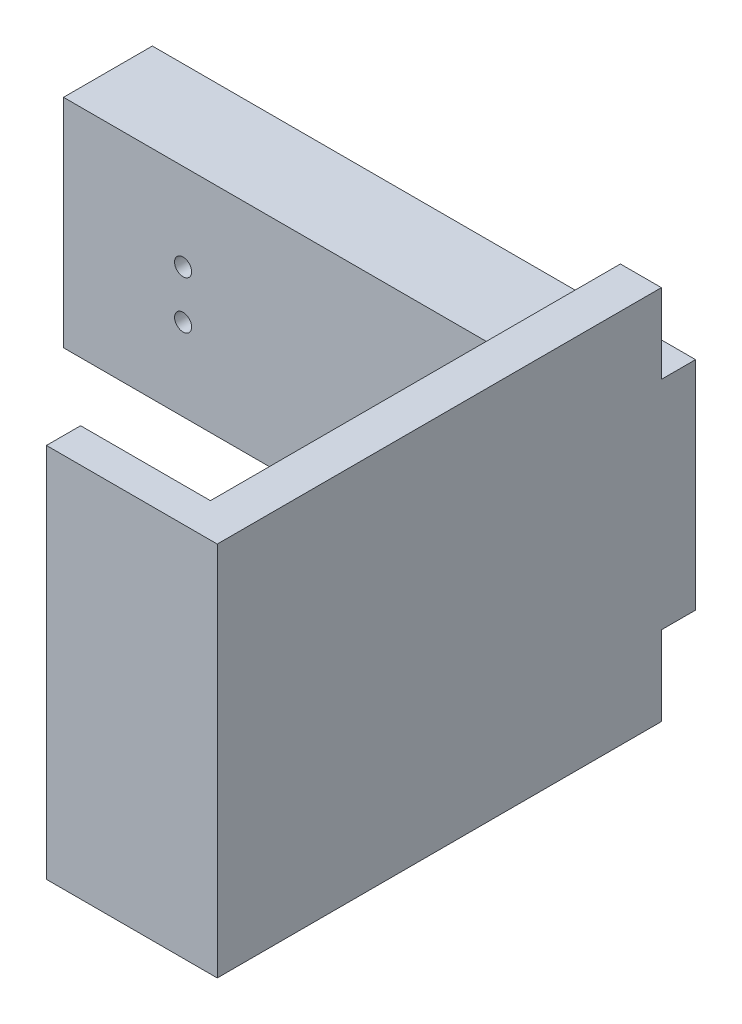
ISO-10303-21;
HEADER;
FILE_DESCRIPTION(('STEP AP214'),'2;1');
FILE_NAME('part.step','',(''),(''),'','','');
FILE_SCHEMA(('AUTOMOTIVE_DESIGN { 1 0 10303 214 1 1 1 1 }'));
ENDSEC;
DATA;
#1=APPLICATION_CONTEXT('core data for automotive mechanical design processes');
#2=APPLICATION_PROTOCOL_DEFINITION('international standard','automotive_design',2000,#1);
#3=PRODUCT_CONTEXT('',#1,'mechanical');
#4=PRODUCT('Part','Part','',(#3));
#5=PRODUCT_RELATED_PRODUCT_CATEGORY('part','',(#4));
#6=PRODUCT_DEFINITION_FORMATION('','',#4);
#7=PRODUCT_DEFINITION_CONTEXT('part definition',#1,'design');
#8=PRODUCT_DEFINITION('design','',#6,#7);
#9=PRODUCT_DEFINITION_SHAPE('','',#8);
#10=(LENGTH_UNIT() NAMED_UNIT(*) SI_UNIT(.MILLI.,.METRE.));
#11=(NAMED_UNIT(*) PLANE_ANGLE_UNIT() SI_UNIT($,.RADIAN.));
#12=(NAMED_UNIT(*) SI_UNIT($,.STERADIAN.) SOLID_ANGLE_UNIT());
#13=UNCERTAINTY_MEASURE_WITH_UNIT(LENGTH_MEASURE(1.E-05),#10,'distance_accuracy_value','');
#14=(GEOMETRIC_REPRESENTATION_CONTEXT(3) GLOBAL_UNCERTAINTY_ASSIGNED_CONTEXT((#13)) GLOBAL_UNIT_ASSIGNED_CONTEXT((#10,
#11,#12)) REPRESENTATION_CONTEXT('',''));
#15=CARTESIAN_POINT('',(0.,0.,0.));
#16=DIRECTION('',(0.,0.,1.));
#17=DIRECTION('',(1.,0.,0.));
#18=AXIS2_PLACEMENT_3D('',#15,#16,#17);
#19=CARTESIAN_POINT('',(-12.,110.,-120.));
#20=DIRECTION('',(1.,0.,0.));
#21=DIRECTION('',(0.,1.,0.));
#22=AXIS2_PLACEMENT_3D('',#19,#20,#21);
#23=PLANE('',#22);
#24=DIRECTION('',(0.,-1.,0.));
#25=VECTOR('',#24,1.);
#26=CARTESIAN_POINT('',(-12.,43.25,-122.));
#27=LINE('',#26,#25);
#28=CARTESIAN_POINT('',(-12.,43.25,-122.));
#29=VERTEX_POINT('',#28);
#30=CARTESIAN_POINT('',(-12.,33.25,-122.));
#31=VERTEX_POINT('',#30);
#32=EDGE_CURVE('E273',#29,#31,#27,.T.);
#33=ORIENTED_EDGE('',*,*,#32,.T.);
#34=DIRECTION('',(0.,0.,1.));
#35=VECTOR('',#34,1.);
#36=CARTESIAN_POINT('',(-12.,33.25,0.));
#37=LINE('',#36,#35);
#38=CARTESIAN_POINT('',(-12.,33.25,-114.));
#39=VERTEX_POINT('',#38);
#40=EDGE_CURVE('E315',#31,#39,#37,.T.);
#41=ORIENTED_EDGE('',*,*,#40,.T.);
#42=DIRECTION('',(0.,-1.,0.));
#43=VECTOR('',#42,1.);
#44=CARTESIAN_POINT('',(-12.,0.,-114.));
#45=LINE('',#44,#43);
#46=CARTESIAN_POINT('',(-12.,76.75,-114.));
#47=VERTEX_POINT('',#46);
#48=EDGE_CURVE('E312',#47,#39,#45,.T.);
#49=ORIENTED_EDGE('',*,*,#48,.F.);
#50=DIRECTION('',(0.,0.,1.));
#51=VECTOR('',#50,1.);
#52=CARTESIAN_POINT('',(-12.,76.75,0.));
#53=LINE('',#52,#51);
#54=CARTESIAN_POINT('',(-12.,76.75,-122.));
#55=VERTEX_POINT('',#54);
#56=EDGE_CURVE('E309',#55,#47,#53,.T.);
#57=ORIENTED_EDGE('',*,*,#56,.F.);
#58=DIRECTION('',(0.,1.,0.));
#59=VECTOR('',#58,1.);
#60=CARTESIAN_POINT('',(-12.,66.75,-122.));
#61=LINE('',#60,#59);
#62=CARTESIAN_POINT('',(-12.,66.75,-122.));
#63=VERTEX_POINT('',#62);
#64=EDGE_CURVE('E284',#63,#55,#61,.T.);
#65=ORIENTED_EDGE('',*,*,#64,.F.);
#66=DIRECTION('',(0.,0.,1.));
#67=VECTOR('',#66,1.);
#68=CARTESIAN_POINT('',(-12.,66.75,-130.));
#69=LINE('',#68,#67);
#70=CARTESIAN_POINT('',(-12.,66.75,-130.));
#71=VERTEX_POINT('',#70);
#72=EDGE_CURVE('E276',#71,#63,#69,.T.);
#73=ORIENTED_EDGE('',*,*,#72,.F.);
#74=DIRECTION('',(0.,1.,0.));
#75=VECTOR('',#74,1.);
#76=CARTESIAN_POINT('',(-12.,76.75,-130.));
#77=LINE('',#76,#75);
#78=CARTESIAN_POINT('',(-12.,43.25,-130.));
#79=VERTEX_POINT('',#78);
#80=EDGE_CURVE('E294',#79,#71,#77,.T.);
#81=ORIENTED_EDGE('',*,*,#80,.F.);
#82=DIRECTION('',(0.,0.,-1.));
#83=VECTOR('',#82,1.);
#84=CARTESIAN_POINT('',(-12.,43.25,-130.));
#85=LINE('',#84,#83);
#86=EDGE_CURVE('E260',#29,#79,#85,.T.);
#87=ORIENTED_EDGE('',*,*,#86,.F.);
#88=EDGE_LOOP('',(#33,#41,#49,#57,#65,#73,#81,#87));
#89=FACE_BOUND('',#88,.T.);
#90=ADVANCED_FACE('F39',(#89),#23,.F.);
#91=CARTESIAN_POINT('',(-164.,33.25,0.));
#92=DIRECTION('',(0.,1.,0.));
#93=DIRECTION('',(-1.,0.,0.));
#94=AXIS2_PLACEMENT_3D('',#91,#92,#93);
#95=PLANE('',#94);
#96=DIRECTION('',(0.,0.,-1.));
#97=VECTOR('',#96,1.);
#98=CARTESIAN_POINT('',(-159.,33.25,0.));
#99=LINE('',#98,#97);
#100=CARTESIAN_POINT('',(-159.,33.25,-114.));
#101=VERTEX_POINT('',#100);
#102=CARTESIAN_POINT('',(-159.,33.25,-122.));
#103=VERTEX_POINT('',#102);
#104=EDGE_CURVE('E327',#101,#103,#99,.T.);
#105=ORIENTED_EDGE('',*,*,#104,.F.);
#106=DIRECTION('',(1.,0.,0.));
#107=VECTOR('',#106,1.);
#108=CARTESIAN_POINT('',(-164.,33.25,-114.));
#109=LINE('',#108,#107);
#110=EDGE_CURVE('E205',#101,#39,#109,.T.);
#111=ORIENTED_EDGE('',*,*,#110,.T.);
#112=ORIENTED_EDGE('',*,*,#40,.F.);
#113=DIRECTION('',(1.,0.,0.));
#114=VECTOR('',#113,1.);
#115=CARTESIAN_POINT('',(-12.,33.25,-122.));
#116=LINE('',#115,#114);
#117=EDGE_CURVE('E257',#103,#31,#116,.T.);
#118=ORIENTED_EDGE('',*,*,#117,.F.);
#119=EDGE_LOOP('',(#105,#111,#112,#118));
#120=FACE_BOUND('',#119,.T.);
#121=ADVANCED_FACE('F326',(#120),#95,.T.);
#122=CARTESIAN_POINT('',(-164.,76.75,0.));
#123=DIRECTION('',(0.,1.,0.));
#124=DIRECTION('',(-1.,0.,0.));
#125=AXIS2_PLACEMENT_3D('',#122,#123,#124);
#126=PLANE('',#125);
#127=DIRECTION('',(1.,0.,0.));
#128=VECTOR('',#127,1.);
#129=CARTESIAN_POINT('',(-164.,76.75,-114.));
#130=LINE('',#129,#128);
#131=CARTESIAN_POINT('',(-159.,76.75,-114.));
#132=VERTEX_POINT('',#131);
#133=EDGE_CURVE('E200',#132,#47,#130,.T.);
#134=ORIENTED_EDGE('',*,*,#133,.F.);
#135=DIRECTION('',(0.,0.,-1.));
#136=VECTOR('',#135,1.);
#137=CARTESIAN_POINT('',(-159.,76.75,0.));
#138=LINE('',#137,#136);
#139=CARTESIAN_POINT('',(-159.,76.75,-122.));
#140=VERTEX_POINT('',#139);
#141=EDGE_CURVE('E406',#132,#140,#138,.T.);
#142=ORIENTED_EDGE('',*,*,#141,.T.);
#143=DIRECTION('',(-1.,0.,0.));
#144=VECTOR('',#143,1.);
#145=CARTESIAN_POINT('',(-12.,76.75,-122.));
#146=LINE('',#145,#144);
#147=EDGE_CURVE('E275',#55,#140,#146,.T.);
#148=ORIENTED_EDGE('',*,*,#147,.F.);
#149=ORIENTED_EDGE('',*,*,#56,.T.);
#150=EDGE_LOOP('',(#134,#142,#148,#149));
#151=FACE_BOUND('',#150,.T.);
#152=ADVANCED_FACE('F340',(#151),#126,.F.);
#153=CARTESIAN_POINT('',(0.,0.,-120.));
#154=DIRECTION('',(0.,0.,-1.));
#155=DIRECTION('',(-1.,0.,0.));
#156=AXIS2_PLACEMENT_3D('',#153,#154,#155);
#157=PLANE('',#156);
#158=DIRECTION('',(-1.,0.,0.));
#159=VECTOR('',#158,1.);
#160=CARTESIAN_POINT('',(-164.,23.25,-120.));
#161=LINE('',#160,#159);
#162=CARTESIAN_POINT('',(0.,23.25,-120.));
#163=VERTEX_POINT('',#162);
#164=CARTESIAN_POINT('',(-12.,23.25,-120.));
#165=VERTEX_POINT('',#164);
#166=EDGE_CURVE('E61',#163,#165,#161,.T.);
#167=ORIENTED_EDGE('',*,*,#166,.F.);
#168=DIRECTION('',(0.,-1.,0.));
#169=VECTOR('',#168,1.);
#170=CARTESIAN_POINT('',(0.,110.,-120.));
#171=LINE('',#170,#169);
#172=CARTESIAN_POINT('',(0.,0.,-120.));
#173=VERTEX_POINT('',#172);
#174=EDGE_CURVE('E203',#163,#173,#171,.T.);
#175=ORIENTED_EDGE('',*,*,#174,.T.);
#176=DIRECTION('',(-1.,0.,0.));
#177=VECTOR('',#176,1.);
#178=CARTESIAN_POINT('',(0.,0.,-120.));
#179=LINE('',#178,#177);
#180=CARTESIAN_POINT('',(-12.,0.,-120.));
#181=VERTEX_POINT('',#180);
#182=EDGE_CURVE('E211',#173,#181,#179,.T.);
#183=ORIENTED_EDGE('',*,*,#182,.T.);
#184=DIRECTION('',(0.,1.,0.));
#185=VECTOR('',#184,1.);
#186=CARTESIAN_POINT('',(-12.,110.,-120.));
#187=LINE('',#186,#185);
#188=EDGE_CURVE('E214',#181,#165,#187,.T.);
#189=ORIENTED_EDGE('',*,*,#188,.T.);
#190=EDGE_LOOP('',(#167,#175,#183,#189));
#191=FACE_BOUND('',#190,.T.);
#192=ADVANCED_FACE('F381',(#191),#157,.T.);
#193=DIRECTION('',(0.,0.,-1.));
#194=VECTOR('',#193,1.);
#195=CARTESIAN_POINT('',(-12.,86.75,0.));
#196=LINE('',#195,#194);
#197=CARTESIAN_POINT('',(-12.,86.75,-104.));
#198=VERTEX_POINT('',#197);
#199=CARTESIAN_POINT('',(-12.,86.75,-120.));
#200=VERTEX_POINT('',#199);
#201=EDGE_CURVE('E307',#198,#200,#196,.T.);
#202=ORIENTED_EDGE('',*,*,#201,.F.);
#203=DIRECTION('',(0.,1.,0.));
#204=VECTOR('',#203,1.);
#205=CARTESIAN_POINT('',(-12.,0.,-104.));
#206=LINE('',#205,#204);
#207=CARTESIAN_POINT('',(-12.,23.25,-104.));
#208=VERTEX_POINT('',#207);
#209=EDGE_CURVE('E197',#208,#198,#206,.T.);
#210=ORIENTED_EDGE('',*,*,#209,.F.);
#211=DIRECTION('',(0.,0.,1.));
#212=VECTOR('',#211,1.);
#213=CARTESIAN_POINT('',(-12.,23.25,0.));
#214=LINE('',#213,#212);
#215=EDGE_CURVE('E318',#165,#208,#214,.T.);
#216=ORIENTED_EDGE('',*,*,#215,.F.);
#217=ORIENTED_EDGE('',*,*,#188,.F.);
#218=DIRECTION('',(0.,0.,1.));
#219=VECTOR('',#218,1.);
#220=CARTESIAN_POINT('',(-12.,0.,-120.));
#221=LINE('',#220,#219);
#222=CARTESIAN_POINT('',(-12.,0.,0.));
#223=VERTEX_POINT('',#222);
#224=EDGE_CURVE('E222',#181,#223,#221,.T.);
#225=ORIENTED_EDGE('',*,*,#224,.T.);
#226=DIRECTION('',(0.,1.,0.));
#227=VECTOR('',#226,1.);
#228=CARTESIAN_POINT('',(-12.,110.,0.));
#229=LINE('',#228,#227);
#230=CARTESIAN_POINT('',(-12.,110.,0.));
#231=VERTEX_POINT('',#230);
#232=EDGE_CURVE('E199',#223,#231,#229,.T.);
#233=ORIENTED_EDGE('',*,*,#232,.T.);
#234=DIRECTION('',(0.,0.,1.));
#235=VECTOR('',#234,1.);
#236=CARTESIAN_POINT('',(-12.,110.,-120.));
#237=LINE('',#236,#235);
#238=CARTESIAN_POINT('',(-12.,110.,-120.));
#239=VERTEX_POINT('',#238);
#240=EDGE_CURVE('E218',#239,#231,#237,.T.);
#241=ORIENTED_EDGE('',*,*,#240,.F.);
#242=EDGE_CURVE('E213',#200,#239,#187,.T.);
#243=ORIENTED_EDGE('',*,*,#242,.F.);
#244=EDGE_LOOP('',(#202,#210,#216,#217,#225,#233,#241,#243));
#245=FACE_BOUND('',#244,.T.);
#246=ADVANCED_FACE('F372',(#245),#23,.F.);
#247=CARTESIAN_POINT('',(0.,0.,0.));
#248=DIRECTION('',(0.,0.,1.));
#249=DIRECTION('',(1.,0.,0.));
#250=AXIS2_PLACEMENT_3D('',#247,#248,#249);
#251=PLANE('',#250);
#252=ORIENTED_EDGE('',*,*,#232,.F.);
#253=DIRECTION('',(1.,0.,0.));
#254=VECTOR('',#253,1.);
#255=CARTESIAN_POINT('',(0.,0.,0.));
#256=LINE('',#255,#254);
#257=CARTESIAN_POINT('',(-50.,0.,0.));
#258=VERTEX_POINT('',#257);
#259=EDGE_CURVE('E230',#258,#223,#256,.T.);
#260=ORIENTED_EDGE('',*,*,#259,.F.);
#261=DIRECTION('',(0.,-1.,0.));
#262=VECTOR('',#261,1.);
#263=CARTESIAN_POINT('',(-50.,0.,0.));
#264=LINE('',#263,#262);
#265=CARTESIAN_POINT('',(-50.,110.,0.));
#266=VERTEX_POINT('',#265);
#267=EDGE_CURVE('E238',#266,#258,#264,.T.);
#268=ORIENTED_EDGE('',*,*,#267,.F.);
#269=DIRECTION('',(-1.,0.,0.));
#270=VECTOR('',#269,1.);
#271=CARTESIAN_POINT('',(0.,110.,0.));
#272=LINE('',#271,#270);
#273=EDGE_CURVE('E225',#231,#266,#272,.T.);
#274=ORIENTED_EDGE('',*,*,#273,.F.);
#275=EDGE_LOOP('',(#252,#260,#268,#274));
#276=FACE_BOUND('',#275,.T.);
#277=ADVANCED_FACE('F380',(#276),#251,.F.);
#278=CARTESIAN_POINT('',(0.,0.,10.));
#279=DIRECTION('',(-1.,0.,0.));
#280=DIRECTION('',(0.,-1.,0.));
#281=AXIS2_PLACEMENT_3D('',#278,#279,#280);
#282=PLANE('',#281);
#283=DIRECTION('',(0.,0.,-1.));
#284=VECTOR('',#283,1.);
#285=CARTESIAN_POINT('',(0.,0.,10.));
#286=LINE('',#285,#284);
#287=CARTESIAN_POINT('',(0.,0.,10.));
#288=VERTEX_POINT('',#287);
#289=EDGE_CURVE('E236',#288,#173,#286,.T.);
#290=ORIENTED_EDGE('',*,*,#289,.T.);
#291=ORIENTED_EDGE('',*,*,#174,.F.);
#292=DIRECTION('',(0.,0.,1.));
#293=VECTOR('',#292,1.);
#294=CARTESIAN_POINT('',(0.,23.25,-130.));
#295=LINE('',#294,#293);
#296=CARTESIAN_POINT('',(0.,23.25,-130.));
#297=VERTEX_POINT('',#296);
#298=EDGE_CURVE('E297',#297,#163,#295,.T.);
#299=ORIENTED_EDGE('',*,*,#298,.F.);
#300=DIRECTION('',(0.,-1.,0.));
#301=VECTOR('',#300,1.);
#302=CARTESIAN_POINT('',(0.,86.75,-130.));
#303=LINE('',#302,#301);
#304=CARTESIAN_POINT('',(0.,86.75,-130.));
#305=VERTEX_POINT('',#304);
#306=EDGE_CURVE('E289',#305,#297,#303,.T.);
#307=ORIENTED_EDGE('',*,*,#306,.F.);
#308=DIRECTION('',(0.,0.,1.));
#309=VECTOR('',#308,1.);
#310=CARTESIAN_POINT('',(0.,86.75,-130.));
#311=LINE('',#310,#309);
#312=CARTESIAN_POINT('',(0.,86.75,-120.));
#313=VERTEX_POINT('',#312);
#314=EDGE_CURVE('E303',#305,#313,#311,.T.);
#315=ORIENTED_EDGE('',*,*,#314,.T.);
#316=CARTESIAN_POINT('',(0.,110.,-120.));
#317=VERTEX_POINT('',#316);
#318=EDGE_CURVE('E209',#317,#313,#171,.T.);
#319=ORIENTED_EDGE('',*,*,#318,.F.);
#320=DIRECTION('',(0.,0.,-1.));
#321=VECTOR('',#320,1.);
#322=CARTESIAN_POINT('',(0.,110.,10.));
#323=LINE('',#322,#321);
#324=CARTESIAN_POINT('',(0.,110.,10.));
#325=VERTEX_POINT('',#324);
#326=EDGE_CURVE('E250',#325,#317,#323,.T.);
#327=ORIENTED_EDGE('',*,*,#326,.F.);
#328=DIRECTION('',(0.,1.,0.));
#329=VECTOR('',#328,1.);
#330=CARTESIAN_POINT('',(0.,0.,10.));
#331=LINE('',#330,#329);
#332=EDGE_CURVE('E226',#288,#325,#331,.T.);
#333=ORIENTED_EDGE('',*,*,#332,.F.);
#334=EDGE_LOOP('',(#290,#291,#299,#307,#315,#319,#327,#333));
#335=FACE_BOUND('',#334,.T.);
#336=ADVANCED_FACE('F41',(#335),#282,.F.);
#337=CARTESIAN_POINT('',(0.,110.,10.));
#338=DIRECTION('',(0.,-1.,0.));
#339=DIRECTION('',(0.,0.,-1.));
#340=AXIS2_PLACEMENT_3D('',#337,#338,#339);
#341=PLANE('',#340);
#342=ORIENTED_EDGE('',*,*,#326,.T.);
#343=DIRECTION('',(1.,0.,0.));
#344=VECTOR('',#343,1.);
#345=CARTESIAN_POINT('',(0.,110.,-120.));
#346=LINE('',#345,#344);
#347=EDGE_CURVE('E216',#239,#317,#346,.T.);
#348=ORIENTED_EDGE('',*,*,#347,.F.);
#349=ORIENTED_EDGE('',*,*,#240,.T.);
#350=ORIENTED_EDGE('',*,*,#273,.T.);
#351=DIRECTION('',(0.,0.,-1.));
#352=VECTOR('',#351,1.);
#353=CARTESIAN_POINT('',(-50.,110.,10.));
#354=LINE('',#353,#352);
#355=CARTESIAN_POINT('',(-50.,110.,10.));
#356=VERTEX_POINT('',#355);
#357=EDGE_CURVE('E247',#356,#266,#354,.T.);
#358=ORIENTED_EDGE('',*,*,#357,.F.);
#359=DIRECTION('',(-1.,0.,0.));
#360=VECTOR('',#359,1.);
#361=CARTESIAN_POINT('',(0.,110.,10.));
#362=LINE('',#361,#360);
#363=EDGE_CURVE('E229',#325,#356,#362,.T.);
#364=ORIENTED_EDGE('',*,*,#363,.F.);
#365=EDGE_LOOP('',(#342,#348,#349,#350,#358,#364));
#366=FACE_BOUND('',#365,.T.);
#367=ADVANCED_FACE('F512',(#366),#341,.F.);
#368=CARTESIAN_POINT('',(-50.,0.,10.));
#369=DIRECTION('',(1.,0.,0.));
#370=DIRECTION('',(0.,0.,-1.));
#371=AXIS2_PLACEMENT_3D('',#368,#369,#370);
#372=PLANE('',#371);
#373=ORIENTED_EDGE('',*,*,#267,.T.);
#374=DIRECTION('',(0.,0.,-1.));
#375=VECTOR('',#374,1.);
#376=CARTESIAN_POINT('',(-50.,0.,10.));
#377=LINE('',#376,#375);
#378=CARTESIAN_POINT('',(-50.,0.,10.));
#379=VERTEX_POINT('',#378);
#380=EDGE_CURVE('E244',#379,#258,#377,.T.);
#381=ORIENTED_EDGE('',*,*,#380,.F.);
#382=DIRECTION('',(0.,-1.,0.));
#383=VECTOR('',#382,1.);
#384=CARTESIAN_POINT('',(-50.,0.,10.));
#385=LINE('',#384,#383);
#386=EDGE_CURVE('E232',#356,#379,#385,.T.);
#387=ORIENTED_EDGE('',*,*,#386,.F.);
#388=ORIENTED_EDGE('',*,*,#357,.T.);
#389=EDGE_LOOP('',(#373,#381,#387,#388));
#390=FACE_BOUND('',#389,.T.);
#391=ADVANCED_FACE('F539',(#390),#372,.F.);
#392=CARTESIAN_POINT('',(0.,0.,10.));
#393=DIRECTION('',(0.,1.,0.));
#394=DIRECTION('',(-1.,0.,0.));
#395=AXIS2_PLACEMENT_3D('',#392,#393,#394);
#396=PLANE('',#395);
#397=ORIENTED_EDGE('',*,*,#259,.T.);
#398=ORIENTED_EDGE('',*,*,#224,.F.);
#399=ORIENTED_EDGE('',*,*,#182,.F.);
#400=ORIENTED_EDGE('',*,*,#289,.F.);
#401=DIRECTION('',(1.,0.,0.));
#402=VECTOR('',#401,1.);
#403=CARTESIAN_POINT('',(0.,0.,10.));
#404=LINE('',#403,#402);
#405=EDGE_CURVE('E234',#379,#288,#404,.T.);
#406=ORIENTED_EDGE('',*,*,#405,.F.);
#407=ORIENTED_EDGE('',*,*,#380,.T.);
#408=EDGE_LOOP('',(#397,#398,#399,#400,#406,#407));
#409=FACE_BOUND('',#408,.T.);
#410=ADVANCED_FACE('F534',(#409),#396,.F.);
#411=CARTESIAN_POINT('',(0.,0.,10.));
#412=DIRECTION('',(0.,0.,1.));
#413=DIRECTION('',(1.,0.,0.));
#414=AXIS2_PLACEMENT_3D('',#411,#412,#413);
#415=PLANE('',#414);
#416=ORIENTED_EDGE('',*,*,#332,.T.);
#417=ORIENTED_EDGE('',*,*,#363,.T.);
#418=ORIENTED_EDGE('',*,*,#386,.T.);
#419=ORIENTED_EDGE('',*,*,#405,.T.);
#420=EDGE_LOOP('',(#416,#417,#418,#419));
#421=FACE_BOUND('',#420,.T.);
#422=ADVANCED_FACE('F426',(#421),#415,.T.);
#423=DIRECTION('',(1.,0.,0.));
#424=VECTOR('',#423,1.);
#425=CARTESIAN_POINT('',(-12.,86.75,-120.));
#426=LINE('',#425,#424);
#427=EDGE_CURVE('E47',#200,#313,#426,.T.);
#428=ORIENTED_EDGE('',*,*,#427,.F.);
#429=ORIENTED_EDGE('',*,*,#242,.T.);
#430=ORIENTED_EDGE('',*,*,#347,.T.);
#431=ORIENTED_EDGE('',*,*,#318,.T.);
#432=EDGE_LOOP('',(#428,#429,#430,#431));
#433=FACE_BOUND('',#432,.T.);
#434=ADVANCED_FACE('F389',(#433),#157,.T.);
#435=CARTESIAN_POINT('',(-164.,0.,-104.));
#436=DIRECTION('',(0.,0.,-1.));
#437=DIRECTION('',(-1.,0.,0.));
#438=AXIS2_PLACEMENT_3D('',#435,#436,#437);
#439=PLANE('',#438);
#440=CARTESIAN_POINT('',(-124.,61.25,-104.));
#441=DIRECTION('',(0.,0.,1.));
#442=DIRECTION('',(1.,0.,0.));
#443=AXIS2_PLACEMENT_3D('',#440,#441,#442);
#444=CIRCLE('',#443,2.5);
#445=CARTESIAN_POINT('',(-121.5,61.25,-104.));
#446=VERTEX_POINT('',#445);
#447=EDGE_CURVE('E255',#446,#446,#444,.T.);
#448=ORIENTED_EDGE('',*,*,#447,.F.);
#449=EDGE_LOOP('',(#448));
#450=FACE_BOUND('',#449,.T.);
#451=CARTESIAN_POINT('',(-124.,47.25,-104.));
#452=DIRECTION('',(0.,0.,1.));
#453=DIRECTION('',(1.,0.,0.));
#454=AXIS2_PLACEMENT_3D('',#451,#452,#453);
#455=CIRCLE('',#454,2.5);
#456=CARTESIAN_POINT('',(-121.5,47.25,-104.));
#457=VERTEX_POINT('',#456);
#458=EDGE_CURVE('E410',#457,#457,#455,.T.);
#459=ORIENTED_EDGE('',*,*,#458,.F.);
#460=EDGE_LOOP('',(#459));
#461=FACE_BOUND('',#460,.T.);
#462=DIRECTION('',(1.,0.,0.));
#463=VECTOR('',#462,1.);
#464=CARTESIAN_POINT('',(-164.,86.75,-104.));
#465=LINE('',#464,#463);
#466=CARTESIAN_POINT('',(-159.,86.75,-104.));
#467=VERTEX_POINT('',#466);
#468=EDGE_CURVE('E189',#467,#198,#465,.T.);
#469=ORIENTED_EDGE('',*,*,#468,.F.);
#470=DIRECTION('',(0.,1.,0.));
#471=VECTOR('',#470,1.);
#472=CARTESIAN_POINT('',(-159.,86.75,-104.));
#473=LINE('',#472,#471);
#474=CARTESIAN_POINT('',(-159.,23.25,-104.));
#475=VERTEX_POINT('',#474);
#476=EDGE_CURVE('E174',#475,#467,#473,.T.);
#477=ORIENTED_EDGE('',*,*,#476,.F.);
#478=DIRECTION('',(1.,0.,0.));
#479=VECTOR('',#478,1.);
#480=CARTESIAN_POINT('',(-164.,23.25,-104.));
#481=LINE('',#480,#479);
#482=EDGE_CURVE('E321',#475,#208,#481,.T.);
#483=ORIENTED_EDGE('',*,*,#482,.T.);
#484=ORIENTED_EDGE('',*,*,#209,.T.);
#485=EDGE_LOOP('',(#469,#477,#483,#484));
#486=FACE_BOUND('',#485,.T.);
#487=ADVANCED_FACE('F195',(#450,#461,#486),#439,.F.);
#488=CARTESIAN_POINT('',(-164.,86.75,0.));
#489=DIRECTION('',(0.,-1.,0.));
#490=DIRECTION('',(1.,0.,0.));
#491=AXIS2_PLACEMENT_3D('',#488,#489,#490);
#492=PLANE('',#491);
#493=DIRECTION('',(1.,0.,0.));
#494=VECTOR('',#493,1.);
#495=CARTESIAN_POINT('',(-164.,86.75,-130.));
#496=LINE('',#495,#494);
#497=CARTESIAN_POINT('',(-159.,86.75,-130.));
#498=VERTEX_POINT('',#497);
#499=EDGE_CURVE('E192',#498,#305,#496,.T.);
#500=ORIENTED_EDGE('',*,*,#499,.F.);
#501=DIRECTION('',(0.,0.,-1.));
#502=VECTOR('',#501,1.);
#503=CARTESIAN_POINT('',(-159.,86.75,-104.));
#504=LINE('',#503,#502);
#505=EDGE_CURVE('E177',#467,#498,#504,.T.);
#506=ORIENTED_EDGE('',*,*,#505,.F.);
#507=ORIENTED_EDGE('',*,*,#468,.T.);
#508=ORIENTED_EDGE('',*,*,#201,.T.);
#509=ORIENTED_EDGE('',*,*,#427,.T.);
#510=ORIENTED_EDGE('',*,*,#314,.F.);
#511=EDGE_LOOP('',(#500,#506,#507,#508,#509,#510));
#512=FACE_BOUND('',#511,.T.);
#513=ADVANCED_FACE('F187',(#512),#492,.F.);
#514=CARTESIAN_POINT('',(-164.,0.,-114.));
#515=DIRECTION('',(0.,0.,1.));
#516=DIRECTION('',(0.,-1.,0.));
#517=AXIS2_PLACEMENT_3D('',#514,#515,#516);
#518=PLANE('',#517);
#519=CARTESIAN_POINT('',(-124.,61.25,-114.));
#520=DIRECTION('',(0.,0.,1.));
#521=DIRECTION('',(0.,-1.,0.));
#522=AXIS2_PLACEMENT_3D('',#519,#520,#521);
#523=CIRCLE('',#522,2.5);
#524=CARTESIAN_POINT('',(-124.,58.75,-114.));
#525=VERTEX_POINT('',#524);
#526=EDGE_CURVE('E254',#525,#525,#523,.T.);
#527=ORIENTED_EDGE('',*,*,#526,.T.);
#528=EDGE_LOOP('',(#527));
#529=FACE_BOUND('',#528,.T.);
#530=CARTESIAN_POINT('',(-124.,47.25,-114.));
#531=DIRECTION('',(0.,0.,1.));
#532=DIRECTION('',(0.,-1.,0.));
#533=AXIS2_PLACEMENT_3D('',#530,#531,#532);
#534=CIRCLE('',#533,2.5);
#535=CARTESIAN_POINT('',(-124.,44.75,-114.));
#536=VERTEX_POINT('',#535);
#537=EDGE_CURVE('E252',#536,#536,#534,.T.);
#538=ORIENTED_EDGE('',*,*,#537,.T.);
#539=EDGE_LOOP('',(#538));
#540=FACE_BOUND('',#539,.T.);
#541=ORIENTED_EDGE('',*,*,#110,.F.);
#542=DIRECTION('',(0.,1.,0.));
#543=VECTOR('',#542,1.);
#544=CARTESIAN_POINT('',(-159.,0.,-114.));
#545=LINE('',#544,#543);
#546=EDGE_CURVE('E336',#101,#132,#545,.T.);
#547=ORIENTED_EDGE('',*,*,#546,.T.);
#548=ORIENTED_EDGE('',*,*,#133,.T.);
#549=ORIENTED_EDGE('',*,*,#48,.T.);
#550=EDGE_LOOP('',(#541,#547,#548,#549));
#551=FACE_BOUND('',#550,.T.);
#552=ADVANCED_FACE('F334',(#529,#540,#551),#518,.F.);
#553=CARTESIAN_POINT('',(-164.,23.25,0.));
#554=DIRECTION('',(0.,1.,0.));
#555=DIRECTION('',(-1.,0.,0.));
#556=AXIS2_PLACEMENT_3D('',#553,#554,#555);
#557=PLANE('',#556);
#558=ORIENTED_EDGE('',*,*,#482,.F.);
#559=DIRECTION('',(0.,0.,1.));
#560=VECTOR('',#559,1.);
#561=CARTESIAN_POINT('',(-159.,23.25,-104.));
#562=LINE('',#561,#560);
#563=CARTESIAN_POINT('',(-159.,23.25,-130.));
#564=VERTEX_POINT('',#563);
#565=EDGE_CURVE('E180',#564,#475,#562,.T.);
#566=ORIENTED_EDGE('',*,*,#565,.F.);
#567=DIRECTION('',(-1.,0.,0.));
#568=VECTOR('',#567,1.);
#569=CARTESIAN_POINT('',(0.,23.25,-130.));
#570=LINE('',#569,#568);
#571=EDGE_CURVE('E291',#297,#564,#570,.T.);
#572=ORIENTED_EDGE('',*,*,#571,.F.);
#573=ORIENTED_EDGE('',*,*,#298,.T.);
#574=ORIENTED_EDGE('',*,*,#166,.T.);
#575=ORIENTED_EDGE('',*,*,#215,.T.);
#576=EDGE_LOOP('',(#558,#566,#572,#573,#574,#575));
#577=FACE_BOUND('',#576,.T.);
#578=ADVANCED_FACE('F432',(#577),#557,.F.);
#579=CARTESIAN_POINT('',(0.,0.,-130.));
#580=DIRECTION('',(0.,0.,1.));
#581=DIRECTION('',(1.,0.,0.));
#582=AXIS2_PLACEMENT_3D('',#579,#580,#581);
#583=PLANE('',#582);
#584=ORIENTED_EDGE('',*,*,#571,.T.);
#585=DIRECTION('',(0.,-1.,0.));
#586=VECTOR('',#585,1.);
#587=CARTESIAN_POINT('',(-159.,86.75,-130.));
#588=LINE('',#587,#586);
#589=CARTESIAN_POINT('',(-159.,43.25,-130.));
#590=VERTEX_POINT('',#589);
#591=EDGE_CURVE('E193',#590,#564,#588,.T.);
#592=ORIENTED_EDGE('',*,*,#591,.F.);
#593=DIRECTION('',(-1.,0.,0.));
#594=VECTOR('',#593,1.);
#595=CARTESIAN_POINT('',(-12.,43.25,-130.));
#596=LINE('',#595,#594);
#597=EDGE_CURVE('E267',#79,#590,#596,.T.);
#598=ORIENTED_EDGE('',*,*,#597,.F.);
#599=ORIENTED_EDGE('',*,*,#80,.T.);
#600=DIRECTION('',(1.,0.,0.));
#601=VECTOR('',#600,1.);
#602=CARTESIAN_POINT('',(-12.,66.75,-130.));
#603=LINE('',#602,#601);
#604=CARTESIAN_POINT('',(-159.,66.75,-130.));
#605=VERTEX_POINT('',#604);
#606=EDGE_CURVE('E282',#605,#71,#603,.T.);
#607=ORIENTED_EDGE('',*,*,#606,.F.);
#608=EDGE_CURVE('E399',#498,#605,#588,.T.);
#609=ORIENTED_EDGE('',*,*,#608,.F.);
#610=ORIENTED_EDGE('',*,*,#499,.T.);
#611=ORIENTED_EDGE('',*,*,#306,.T.);
#612=EDGE_LOOP('',(#584,#592,#598,#599,#607,#609,#610,#611));
#613=FACE_BOUND('',#612,.T.);
#614=ADVANCED_FACE('F354',(#613),#583,.F.);
#615=CARTESIAN_POINT('',(-12.,66.75,-122.));
#616=DIRECTION('',(0.,0.,-1.));
#617=DIRECTION('',(-1.,0.,0.));
#618=AXIS2_PLACEMENT_3D('',#615,#616,#617);
#619=PLANE('',#618);
#620=ORIENTED_EDGE('',*,*,#147,.T.);
#621=DIRECTION('',(0.,-1.,0.));
#622=VECTOR('',#621,1.);
#623=CARTESIAN_POINT('',(-159.,66.75,-122.));
#624=LINE('',#623,#622);
#625=CARTESIAN_POINT('',(-159.,66.75,-122.));
#626=VERTEX_POINT('',#625);
#627=EDGE_CURVE('E347',#140,#626,#624,.T.);
#628=ORIENTED_EDGE('',*,*,#627,.T.);
#629=DIRECTION('',(-1.,0.,0.));
#630=VECTOR('',#629,1.);
#631=CARTESIAN_POINT('',(-12.,66.75,-122.));
#632=LINE('',#631,#630);
#633=EDGE_CURVE('E279',#63,#626,#632,.T.);
#634=ORIENTED_EDGE('',*,*,#633,.F.);
#635=ORIENTED_EDGE('',*,*,#64,.T.);
#636=EDGE_LOOP('',(#620,#628,#634,#635));
#637=FACE_BOUND('',#636,.T.);
#638=ADVANCED_FACE('F345',(#637),#619,.F.);
#639=CARTESIAN_POINT('',(0.,66.75,0.));
#640=DIRECTION('',(0.,-1.,0.));
#641=DIRECTION('',(1.,0.,0.));
#642=AXIS2_PLACEMENT_3D('',#639,#640,#641);
#643=PLANE('',#642);
#644=DIRECTION('',(0.,0.,1.));
#645=VECTOR('',#644,1.);
#646=CARTESIAN_POINT('',(-159.,66.75,0.));
#647=LINE('',#646,#645);
#648=EDGE_CURVE('E352',#605,#626,#647,.T.);
#649=ORIENTED_EDGE('',*,*,#648,.F.);
#650=ORIENTED_EDGE('',*,*,#606,.T.);
#651=ORIENTED_EDGE('',*,*,#72,.T.);
#652=ORIENTED_EDGE('',*,*,#633,.T.);
#653=EDGE_LOOP('',(#649,#650,#651,#652));
#654=FACE_BOUND('',#653,.T.);
#655=ADVANCED_FACE('F350',(#654),#643,.T.);
#656=CARTESIAN_POINT('',(-12.,43.25,-122.));
#657=DIRECTION('',(0.,0.,-1.));
#658=DIRECTION('',(-1.,0.,0.));
#659=AXIS2_PLACEMENT_3D('',#656,#657,#658);
#660=PLANE('',#659);
#661=DIRECTION('',(1.,0.,0.));
#662=VECTOR('',#661,1.);
#663=CARTESIAN_POINT('',(-12.,43.25,-122.));
#664=LINE('',#663,#662);
#665=CARTESIAN_POINT('',(-159.,43.25,-122.));
#666=VERTEX_POINT('',#665);
#667=EDGE_CURVE('E271',#666,#29,#664,.T.);
#668=ORIENTED_EDGE('',*,*,#667,.F.);
#669=DIRECTION('',(0.,-1.,0.));
#670=VECTOR('',#669,1.);
#671=CARTESIAN_POINT('',(-159.,43.25,-122.));
#672=LINE('',#671,#670);
#673=EDGE_CURVE('E54',#666,#103,#672,.T.);
#674=ORIENTED_EDGE('',*,*,#673,.T.);
#675=ORIENTED_EDGE('',*,*,#117,.T.);
#676=ORIENTED_EDGE('',*,*,#32,.F.);
#677=EDGE_LOOP('',(#668,#674,#675,#676));
#678=FACE_BOUND('',#677,.T.);
#679=ADVANCED_FACE('F360',(#678),#660,.F.);
#680=CARTESIAN_POINT('',(0.,43.25,0.));
#681=DIRECTION('',(0.,-1.,0.));
#682=DIRECTION('',(1.,0.,0.));
#683=AXIS2_PLACEMENT_3D('',#680,#681,#682);
#684=PLANE('',#683);
#685=ORIENTED_EDGE('',*,*,#597,.T.);
#686=DIRECTION('',(0.,0.,1.));
#687=VECTOR('',#686,1.);
#688=CARTESIAN_POINT('',(-159.,43.25,0.));
#689=LINE('',#688,#687);
#690=EDGE_CURVE('E11',#590,#666,#689,.T.);
#691=ORIENTED_EDGE('',*,*,#690,.T.);
#692=ORIENTED_EDGE('',*,*,#667,.T.);
#693=ORIENTED_EDGE('',*,*,#86,.T.);
#694=EDGE_LOOP('',(#685,#691,#692,#693));
#695=FACE_BOUND('',#694,.T.);
#696=ADVANCED_FACE('F358',(#695),#684,.F.);
#697=CARTESIAN_POINT('',(-124.,47.25,-191.));
#698=DIRECTION('',(0.,0.,1.));
#699=DIRECTION('',(1.,0.,0.));
#700=AXIS2_PLACEMENT_3D('',#697,#698,#699);
#701=CYLINDRICAL_SURFACE('',#700,2.5);
#702=ORIENTED_EDGE('',*,*,#458,.T.);
#703=EDGE_LOOP('',(#702));
#704=FACE_BOUND('',#703,.T.);
#705=ORIENTED_EDGE('',*,*,#537,.F.);
#706=EDGE_LOOP('',(#705));
#707=FACE_BOUND('',#706,.T.);
#708=ADVANCED_FACE('F367',(#704,#707),#701,.F.);
#709=CARTESIAN_POINT('',(-124.,61.25,-191.));
#710=DIRECTION('',(0.,0.,1.));
#711=DIRECTION('',(1.,0.,0.));
#712=AXIS2_PLACEMENT_3D('',#709,#710,#711);
#713=CYLINDRICAL_SURFACE('',#712,2.5);
#714=ORIENTED_EDGE('',*,*,#447,.T.);
#715=EDGE_LOOP('',(#714));
#716=FACE_BOUND('',#715,.T.);
#717=ORIENTED_EDGE('',*,*,#526,.F.);
#718=EDGE_LOOP('',(#717));
#719=FACE_BOUND('',#718,.T.);
#720=ADVANCED_FACE('F473',(#716,#719),#713,.F.);
#721=CARTESIAN_POINT('',(-159.,0.,0.));
#722=DIRECTION('',(1.,0.,0.));
#723=DIRECTION('',(0.,0.,-1.));
#724=AXIS2_PLACEMENT_3D('',#721,#722,#723);
#725=PLANE('',#724);
#726=ORIENTED_EDGE('',*,*,#648,.T.);
#727=ORIENTED_EDGE('',*,*,#627,.F.);
#728=ORIENTED_EDGE('',*,*,#141,.F.);
#729=ORIENTED_EDGE('',*,*,#546,.F.);
#730=ORIENTED_EDGE('',*,*,#104,.T.);
#731=ORIENTED_EDGE('',*,*,#673,.F.);
#732=ORIENTED_EDGE('',*,*,#690,.F.);
#733=ORIENTED_EDGE('',*,*,#591,.T.);
#734=ORIENTED_EDGE('',*,*,#565,.T.);
#735=ORIENTED_EDGE('',*,*,#476,.T.);
#736=ORIENTED_EDGE('',*,*,#505,.T.);
#737=ORIENTED_EDGE('',*,*,#608,.T.);
#738=EDGE_LOOP('',(#726,#727,#728,#729,#730,#731,#732,#733,#734,#735,#736,#737));
#739=FACE_BOUND('',#738,.T.);
#740=ADVANCED_FACE('F176',(#739),#725,.F.);
#741=CLOSED_SHELL('',(#90,#121,#152,#192,#246,#277,#336,#367,#391,#410,#422,#434,#487,#513,#552,
#578,#614,#638,#655,#679,#696,#708,#720,#740));
#742=MANIFOLD_SOLID_BREP('B2',#741);
#743=ADVANCED_BREP_SHAPE_REPRESENTATION('',(#18,#742),#14);
#744=SHAPE_DEFINITION_REPRESENTATION(#9,#743);
ENDSEC;
END-ISO-10303-21;
